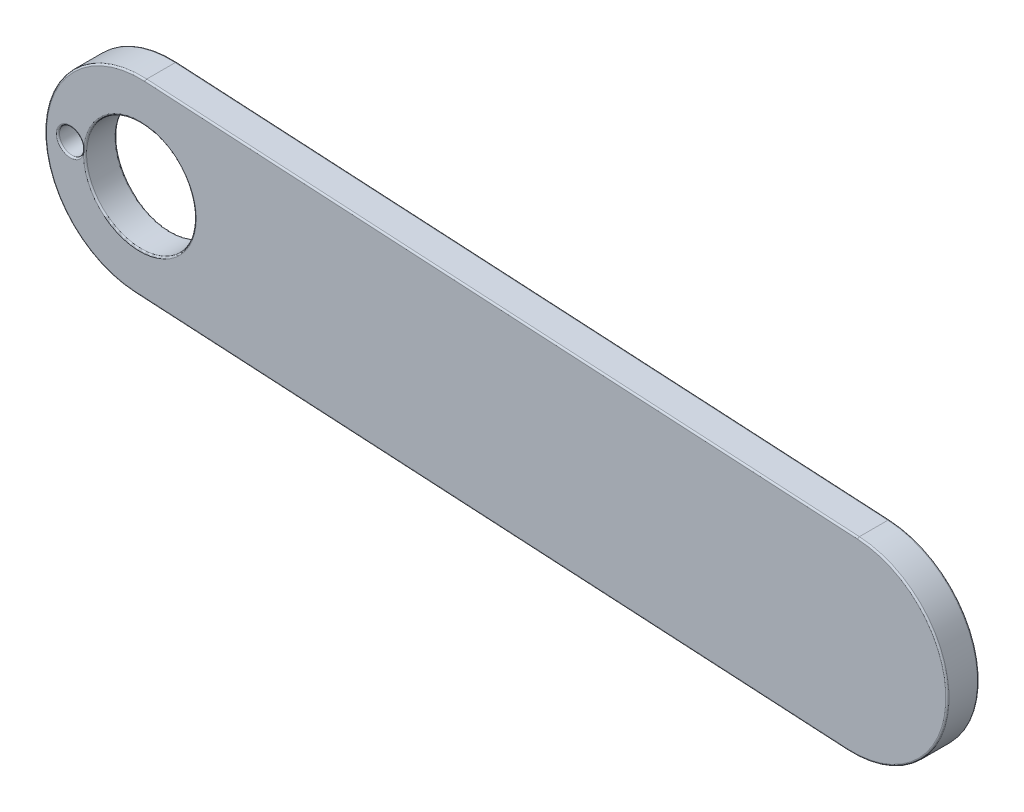
ISO-10303-21;
HEADER;
FILE_DESCRIPTION(('STEP AP214'),'2;1');
FILE_NAME('part.step','',(''),(''),'','','');
FILE_SCHEMA(('AUTOMOTIVE_DESIGN { 1 0 10303 214 1 1 1 1 }'));
ENDSEC;
DATA;
#1=APPLICATION_CONTEXT('core data for automotive mechanical design processes');
#2=APPLICATION_PROTOCOL_DEFINITION('international standard','automotive_design',2000,#1);
#3=PRODUCT_CONTEXT('',#1,'mechanical');
#4=PRODUCT('Part','Part','',(#3));
#5=PRODUCT_RELATED_PRODUCT_CATEGORY('part','',(#4));
#6=PRODUCT_DEFINITION_FORMATION('','',#4);
#7=PRODUCT_DEFINITION_CONTEXT('part definition',#1,'design');
#8=PRODUCT_DEFINITION('design','',#6,#7);
#9=PRODUCT_DEFINITION_SHAPE('','',#8);
#10=(LENGTH_UNIT() NAMED_UNIT(*) SI_UNIT(.MILLI.,.METRE.));
#11=(NAMED_UNIT(*) PLANE_ANGLE_UNIT() SI_UNIT($,.RADIAN.));
#12=(NAMED_UNIT(*) SI_UNIT($,.STERADIAN.) SOLID_ANGLE_UNIT());
#13=UNCERTAINTY_MEASURE_WITH_UNIT(LENGTH_MEASURE(1.E-05),#10,'distance_accuracy_value','');
#14=(GEOMETRIC_REPRESENTATION_CONTEXT(3) GLOBAL_UNCERTAINTY_ASSIGNED_CONTEXT((#13)) GLOBAL_UNIT_ASSIGNED_CONTEXT((#10,
#11,#12)) REPRESENTATION_CONTEXT('',''));
#15=CARTESIAN_POINT('',(0.,0.,0.));
#16=DIRECTION('',(0.,0.,1.));
#17=DIRECTION('',(1.,0.,0.));
#18=AXIS2_PLACEMENT_3D('',#15,#16,#17);
#19=CARTESIAN_POINT('',(0.,0.,6.35));
#20=DIRECTION('',(0.,0.,1.));
#21=DIRECTION('',(1.,0.,0.));
#22=AXIS2_PLACEMENT_3D('',#19,#20,#21);
#23=PLANE('',#22);
#24=CARTESIAN_POINT('',(143.002,-8.02483161981357,6.35));
#25=DIRECTION('',(0.,0.,1.));
#26=DIRECTION('',(1.,0.,0.));
#27=AXIS2_PLACEMENT_3D('',#24,#25,#26);
#28=CIRCLE('',#27,18.7325);
#29=CARTESIAN_POINT('',(141.95244110735,-26.7279057623406,6.35));
#30=VERTEX_POINT('',#29);
#31=CARTESIAN_POINT('',(144.051558892649,10.6782425227134,6.35));
#32=VERTEX_POINT('',#31);
#33=EDGE_CURVE('E43',#30,#32,#28,.T.);
#34=ORIENTED_EDGE('',*,*,#33,.T.);
#35=DIRECTION('',(-0.998429154812596,0.0560287677912468,0.));
#36=VECTOR('',#35,1.);
#37=CARTESIAN_POINT('',(1.04955889264953,18.703074142527,6.35));
#38=LINE('',#37,#36);
#39=CARTESIAN_POINT('',(1.04955889264953,18.703074142527,6.35));
#40=VERTEX_POINT('',#39);
#41=EDGE_CURVE('E11',#32,#40,#38,.T.);
#42=ORIENTED_EDGE('',*,*,#41,.T.);
#43=CARTESIAN_POINT('',(0.,0.,6.35));
#44=DIRECTION('',(0.,0.,1.));
#45=DIRECTION('',(1.,0.,0.));
#46=AXIS2_PLACEMENT_3D('',#43,#44,#45);
#47=CIRCLE('',#46,18.7325);
#48=CARTESIAN_POINT('',(-1.04955889264953,-18.703074142527,6.35));
#49=VERTEX_POINT('',#48);
#50=EDGE_CURVE('E190',#40,#49,#47,.T.);
#51=ORIENTED_EDGE('',*,*,#50,.T.);
#52=DIRECTION('',(0.998429154812596,-0.0560287677912467,0.));
#53=VECTOR('',#52,1.);
#54=CARTESIAN_POINT('',(141.95244110735,-26.7279057623406,6.35));
#55=LINE('',#54,#53);
#56=EDGE_CURVE('E54',#49,#30,#55,.T.);
#57=ORIENTED_EDGE('',*,*,#56,.T.);
#58=EDGE_LOOP('',(#34,#42,#51,#57));
#59=FACE_BOUND('',#58,.T.);
#60=CARTESIAN_POINT('',(0.,0.,6.35));
#61=DIRECTION('',(0.,0.,1.));
#62=DIRECTION('',(1.,0.,0.));
#63=AXIS2_PLACEMENT_3D('',#60,#61,#62);
#64=CIRCLE('',#63,11.3175);
#65=CARTESIAN_POINT('',(11.3175,0.,6.35));
#66=VERTEX_POINT('',#65);
#67=CARTESIAN_POINT('',(-11.3153450902125,-0.220843246224775,6.35));
#68=VERTEX_POINT('',#67);
#69=EDGE_CURVE('E183',#66,#68,#64,.F.);
#70=ORIENTED_EDGE('',*,*,#69,.T.);
#71=CARTESIAN_POINT('',(-13.948055292732,0.782721886043718,6.35));
#72=DIRECTION('',(0.,0.,1.));
#73=DIRECTION('',(1.,0.,0.));
#74=AXIS2_PLACEMENT_3D('',#71,#72,#73);
#75=CIRCLE('',#74,2.817499953);
#76=CARTESIAN_POINT('',(-11.2195940351805,1.48543459490541,6.35));
#77=VERTEX_POINT('',#76);
#78=EDGE_CURVE('E187',#68,#77,#75,.F.);
#79=ORIENTED_EDGE('',*,*,#78,.T.);
#80=CARTESIAN_POINT('',(0.,0.,6.35));
#81=DIRECTION('',(0.,0.,1.));
#82=DIRECTION('',(1.,0.,0.));
#83=AXIS2_PLACEMENT_3D('',#80,#81,#82);
#84=CIRCLE('',#83,11.3175);
#85=EDGE_CURVE('E185',#77,#66,#84,.F.);
#86=ORIENTED_EDGE('',*,*,#85,.T.);
#87=EDGE_LOOP('',(#70,#79,#86));
#88=FACE_BOUND('',#87,.T.);
#89=ADVANCED_FACE('F34',(#59,#88),#23,.T.);
#90=CARTESIAN_POINT('',(0.,0.,0.));
#91=DIRECTION('',(0.,0.,1.));
#92=DIRECTION('',(1.,0.,0.));
#93=AXIS2_PLACEMENT_3D('',#90,#91,#92);
#94=PLANE('',#93);
#95=CARTESIAN_POINT('',(0.,0.,0.));
#96=DIRECTION('',(0.,0.,1.));
#97=DIRECTION('',(1.,0.,0.));
#98=AXIS2_PLACEMENT_3D('',#95,#96,#97);
#99=CIRCLE('',#98,11.3175);
#100=CARTESIAN_POINT('',(11.3175,0.,0.));
#101=VERTEX_POINT('',#100);
#102=CARTESIAN_POINT('',(-11.2195940351805,1.48543459490541,0.));
#103=VERTEX_POINT('',#102);
#104=EDGE_CURVE('E144',#101,#103,#99,.T.);
#105=ORIENTED_EDGE('',*,*,#104,.T.);
#106=CARTESIAN_POINT('',(-13.948055292732,0.782721886043718,0.));
#107=DIRECTION('',(0.,0.,1.));
#108=DIRECTION('',(1.,0.,0.));
#109=AXIS2_PLACEMENT_3D('',#106,#107,#108);
#110=CIRCLE('',#109,2.817499953);
#111=CARTESIAN_POINT('',(-11.3153450902125,-0.220843246224775,0.));
#112=VERTEX_POINT('',#111);
#113=EDGE_CURVE('E152',#103,#112,#110,.T.);
#114=ORIENTED_EDGE('',*,*,#113,.T.);
#115=CARTESIAN_POINT('',(0.,0.,0.));
#116=DIRECTION('',(0.,0.,1.));
#117=DIRECTION('',(1.,0.,0.));
#118=AXIS2_PLACEMENT_3D('',#115,#116,#117);
#119=CIRCLE('',#118,11.3175);
#120=EDGE_CURVE('E146',#112,#101,#119,.T.);
#121=ORIENTED_EDGE('',*,*,#120,.T.);
#122=EDGE_LOOP('',(#105,#114,#121));
#123=FACE_BOUND('',#122,.T.);
#124=CARTESIAN_POINT('',(143.002,-8.02483161981357,0.));
#125=DIRECTION('',(0.,0.,1.));
#126=DIRECTION('',(1.,0.,0.));
#127=AXIS2_PLACEMENT_3D('',#124,#125,#126);
#128=CIRCLE('',#127,18.7325);
#129=CARTESIAN_POINT('',(144.051558892649,10.6782425227134,0.));
#130=VERTEX_POINT('',#129);
#131=CARTESIAN_POINT('',(141.95244110735,-26.7279057623406,0.));
#132=VERTEX_POINT('',#131);
#133=EDGE_CURVE('E143',#130,#132,#128,.F.);
#134=ORIENTED_EDGE('',*,*,#133,.T.);
#135=DIRECTION('',(0.998429154812596,-0.0560287677912467,0.));
#136=VECTOR('',#135,1.);
#137=CARTESIAN_POINT('',(-1.04955889264953,-18.703074142527,0.));
#138=LINE('',#137,#136);
#139=CARTESIAN_POINT('',(-1.04955889264953,-18.703074142527,0.));
#140=VERTEX_POINT('',#139);
#141=EDGE_CURVE('E122',#132,#140,#138,.F.);
#142=ORIENTED_EDGE('',*,*,#141,.T.);
#143=CARTESIAN_POINT('',(0.,0.,0.));
#144=DIRECTION('',(0.,0.,1.));
#145=DIRECTION('',(1.,0.,0.));
#146=AXIS2_PLACEMENT_3D('',#143,#144,#145);
#147=CIRCLE('',#146,18.7325);
#148=CARTESIAN_POINT('',(1.04955889264953,18.703074142527,0.));
#149=VERTEX_POINT('',#148);
#150=EDGE_CURVE('E132',#140,#149,#147,.F.);
#151=ORIENTED_EDGE('',*,*,#150,.T.);
#152=DIRECTION('',(-0.998429154812596,0.0560287677912468,0.));
#153=VECTOR('',#152,1.);
#154=CARTESIAN_POINT('',(1.04955889264953,18.703074142527,0.));
#155=LINE('',#154,#153);
#156=EDGE_CURVE('E138',#149,#130,#155,.F.);
#157=ORIENTED_EDGE('',*,*,#156,.T.);
#158=EDGE_LOOP('',(#134,#142,#151,#157));
#159=FACE_BOUND('',#158,.T.);
#160=ADVANCED_FACE('F141',(#123,#159),#94,.F.);
#161=CARTESIAN_POINT('',(0.,0.,6.35));
#162=DIRECTION('',(0.,0.,-1.));
#163=DIRECTION('',(-1.,0.,0.));
#164=AXIS2_PLACEMENT_3D('',#161,#162,#163);
#165=CYLINDRICAL_SURFACE('',#164,19.05);
#166=DIRECTION('',(0.,0.,-1.));
#167=VECTOR('',#166,1.);
#168=CARTESIAN_POINT('',(1.06734802642325,19.02007539918,6.35));
#169=LINE('',#168,#167);
#170=CARTESIAN_POINT('',(1.06734802642325,19.02007539918,6.0325));
#171=VERTEX_POINT('',#170);
#172=CARTESIAN_POINT('',(1.06734802642325,19.02007539918,0.3175));
#173=VERTEX_POINT('',#172);
#174=EDGE_CURVE('E202',#171,#173,#169,.T.);
#175=ORIENTED_EDGE('',*,*,#174,.T.);
#176=CARTESIAN_POINT('',(0.,0.,0.3175));
#177=DIRECTION('',(0.,0.,1.));
#178=DIRECTION('',(1.,0.,0.));
#179=AXIS2_PLACEMENT_3D('',#176,#177,#178);
#180=CIRCLE('',#179,19.05);
#181=CARTESIAN_POINT('',(-1.06734802642325,-19.02007539918,0.3175));
#182=VERTEX_POINT('',#181);
#183=EDGE_CURVE('E181',#173,#182,#180,.T.);
#184=ORIENTED_EDGE('',*,*,#183,.T.);
#185=DIRECTION('',(0.,0.,-1.));
#186=VECTOR('',#185,1.);
#187=CARTESIAN_POINT('',(-1.06734802642325,-19.02007539918,6.35));
#188=LINE('',#187,#186);
#189=CARTESIAN_POINT('',(-1.06734802642325,-19.02007539918,6.0325));
#190=VERTEX_POINT('',#189);
#191=EDGE_CURVE('E139',#190,#182,#188,.T.);
#192=ORIENTED_EDGE('',*,*,#191,.F.);
#193=CARTESIAN_POINT('',(0.,0.,6.0325));
#194=DIRECTION('',(0.,0.,1.));
#195=DIRECTION('',(1.,0.,0.));
#196=AXIS2_PLACEMENT_3D('',#193,#194,#195);
#197=CIRCLE('',#196,19.05);
#198=EDGE_CURVE('E179',#190,#171,#197,.F.);
#199=ORIENTED_EDGE('',*,*,#198,.T.);
#200=EDGE_LOOP('',(#175,#184,#192,#199));
#201=FACE_BOUND('',#200,.T.);
#202=ADVANCED_FACE('F268',(#201),#165,.T.);
#203=CARTESIAN_POINT('',(-1.06734802642325,-19.02007539918,6.35));
#204=DIRECTION('',(0.0560287677912466,0.998429154812596,0.));
#205=DIRECTION('',(-0.998429154812596,0.0560287677912467,0.));
#206=AXIS2_PLACEMENT_3D('',#203,#204,#205);
#207=PLANE('',#206);
#208=ORIENTED_EDGE('',*,*,#191,.T.);
#209=DIRECTION('',(0.998429154812596,-0.0560287677912467,0.));
#210=VECTOR('',#209,1.);
#211=CARTESIAN_POINT('',(-1.06734802642325,-19.02007539918,0.3175));
#212=LINE('',#211,#210);
#213=CARTESIAN_POINT('',(141.934651973577,-27.0449070189935,0.3175));
#214=VERTEX_POINT('',#213);
#215=EDGE_CURVE('E125',#182,#214,#212,.T.);
#216=ORIENTED_EDGE('',*,*,#215,.T.);
#217=DIRECTION('',(0.,0.,-1.));
#218=VECTOR('',#217,1.);
#219=CARTESIAN_POINT('',(141.934651973577,-27.0449070189935,6.35));
#220=LINE('',#219,#218);
#221=CARTESIAN_POINT('',(141.934651973577,-27.0449070189935,6.0325));
#222=VERTEX_POINT('',#221);
#223=EDGE_CURVE('E265',#222,#214,#220,.T.);
#224=ORIENTED_EDGE('',*,*,#223,.F.);
#225=DIRECTION('',(0.998429154812596,-0.0560287677912467,0.));
#226=VECTOR('',#225,1.);
#227=CARTESIAN_POINT('',(-1.06734802642325,-19.02007539918,6.0325));
#228=LINE('',#227,#226);
#229=EDGE_CURVE('E167',#222,#190,#228,.F.);
#230=ORIENTED_EDGE('',*,*,#229,.T.);
#231=EDGE_LOOP('',(#208,#216,#224,#230));
#232=FACE_BOUND('',#231,.T.);
#233=ADVANCED_FACE('F263',(#232),#207,.F.);
#234=CARTESIAN_POINT('',(143.002,-8.02483161981357,6.35));
#235=DIRECTION('',(0.,0.,-1.));
#236=DIRECTION('',(-1.,0.,0.));
#237=AXIS2_PLACEMENT_3D('',#234,#235,#236);
#238=CYLINDRICAL_SURFACE('',#237,19.05);
#239=ORIENTED_EDGE('',*,*,#223,.T.);
#240=CARTESIAN_POINT('',(143.002,-8.02483161981357,0.3175));
#241=DIRECTION('',(0.,0.,1.));
#242=DIRECTION('',(1.,0.,0.));
#243=AXIS2_PLACEMENT_3D('',#240,#241,#242);
#244=CIRCLE('',#243,19.05);
#245=CARTESIAN_POINT('',(144.069348026423,10.9952437793664,0.3175));
#246=VERTEX_POINT('',#245);
#247=EDGE_CURVE('E172',#214,#246,#244,.T.);
#248=ORIENTED_EDGE('',*,*,#247,.T.);
#249=DIRECTION('',(0.,0.,-1.));
#250=VECTOR('',#249,1.);
#251=CARTESIAN_POINT('',(144.069348026423,10.9952437793664,6.35));
#252=LINE('',#251,#250);
#253=CARTESIAN_POINT('',(144.069348026423,10.9952437793664,6.0325));
#254=VERTEX_POINT('',#253);
#255=EDGE_CURVE('E271',#254,#246,#252,.T.);
#256=ORIENTED_EDGE('',*,*,#255,.F.);
#257=CARTESIAN_POINT('',(143.002,-8.02483161981357,6.0325));
#258=DIRECTION('',(0.,0.,1.));
#259=DIRECTION('',(1.,0.,0.));
#260=AXIS2_PLACEMENT_3D('',#257,#258,#259);
#261=CIRCLE('',#260,19.05);
#262=EDGE_CURVE('E170',#254,#222,#261,.F.);
#263=ORIENTED_EDGE('',*,*,#262,.T.);
#264=EDGE_LOOP('',(#239,#248,#256,#263));
#265=FACE_BOUND('',#264,.T.);
#266=ADVANCED_FACE('F281',(#265),#238,.T.);
#267=CARTESIAN_POINT('',(1.06734802642325,19.02007539918,6.35));
#268=DIRECTION('',(-0.0560287677912468,-0.998429154812596,0.));
#269=DIRECTION('',(0.998429154812596,-0.0560287677912468,0.));
#270=AXIS2_PLACEMENT_3D('',#267,#268,#269);
#271=PLANE('',#270);
#272=ORIENTED_EDGE('',*,*,#255,.T.);
#273=DIRECTION('',(-0.998429154812596,0.0560287677912468,0.));
#274=VECTOR('',#273,1.);
#275=CARTESIAN_POINT('',(1.06734802642325,19.02007539918,0.3175));
#276=LINE('',#275,#274);
#277=EDGE_CURVE('E177',#246,#173,#276,.T.);
#278=ORIENTED_EDGE('',*,*,#277,.T.);
#279=ORIENTED_EDGE('',*,*,#174,.F.);
#280=DIRECTION('',(-0.998429154812596,0.0560287677912468,0.));
#281=VECTOR('',#280,1.);
#282=CARTESIAN_POINT('',(144.069348026423,10.9952437793664,6.0325));
#283=LINE('',#282,#281);
#284=EDGE_CURVE('E174',#171,#254,#283,.F.);
#285=ORIENTED_EDGE('',*,*,#284,.T.);
#286=EDGE_LOOP('',(#272,#278,#279,#285));
#287=FACE_BOUND('',#286,.T.);
#288=ADVANCED_FACE('F285',(#287),#271,.F.);
#289=CARTESIAN_POINT('',(0.,0.,6.35));
#290=DIRECTION('',(0.,0.,-1.));
#291=DIRECTION('',(-1.,0.,0.));
#292=AXIS2_PLACEMENT_3D('',#289,#290,#291);
#293=CYLINDRICAL_SURFACE('',#292,11.);
#294=CARTESIAN_POINT('',(0.,0.,0.3175));
#295=DIRECTION('',(0.,0.,1.));
#296=DIRECTION('',(1.,0.,0.));
#297=AXIS2_PLACEMENT_3D('',#294,#295,#296);
#298=CIRCLE('',#297,11.);
#299=CARTESIAN_POINT('',(11.,0.,0.3175));
#300=VERTEX_POINT('',#299);
#301=EDGE_CURVE('E164',#300,#300,#298,.F.);
#302=ORIENTED_EDGE('',*,*,#301,.T.);
#303=EDGE_LOOP('',(#302));
#304=FACE_BOUND('',#303,.T.);
#305=CARTESIAN_POINT('',(0.,0.,6.0325));
#306=DIRECTION('',(0.,0.,1.));
#307=DIRECTION('',(1.,0.,0.));
#308=AXIS2_PLACEMENT_3D('',#305,#306,#307);
#309=CIRCLE('',#308,11.);
#310=CARTESIAN_POINT('',(11.,0.,6.0325));
#311=VERTEX_POINT('',#310);
#312=EDGE_CURVE('E161',#311,#311,#309,.T.);
#313=ORIENTED_EDGE('',*,*,#312,.T.);
#314=EDGE_LOOP('',(#313));
#315=FACE_BOUND('',#314,.T.);
#316=ADVANCED_FACE('F305',(#304,#315),#293,.F.);
#317=CARTESIAN_POINT('',(-13.948055292732,0.782721886043718,6.35));
#318=DIRECTION('',(0.,0.,-1.));
#319=DIRECTION('',(-1.,0.,0.));
#320=AXIS2_PLACEMENT_3D('',#317,#318,#319);
#321=CYLINDRICAL_SURFACE('',#320,2.499999953);
#322=CARTESIAN_POINT('',(-13.948055292732,0.782721886043718,0.3175));
#323=DIRECTION('',(0.,0.,1.));
#324=DIRECTION('',(1.,0.,0.));
#325=AXIS2_PLACEMENT_3D('',#322,#323,#324);
#326=CIRCLE('',#325,2.499999953);
#327=CARTESIAN_POINT('',(-11.448055339732,0.782721886043718,0.3175));
#328=VERTEX_POINT('',#327);
#329=EDGE_CURVE('E158',#328,#328,#326,.F.);
#330=ORIENTED_EDGE('',*,*,#329,.T.);
#331=EDGE_LOOP('',(#330));
#332=FACE_BOUND('',#331,.T.);
#333=CARTESIAN_POINT('',(-13.948055292732,0.782721886043718,6.0325));
#334=DIRECTION('',(0.,0.,1.));
#335=DIRECTION('',(1.,0.,0.));
#336=AXIS2_PLACEMENT_3D('',#333,#334,#335);
#337=CIRCLE('',#336,2.499999953);
#338=CARTESIAN_POINT('',(-11.448055339732,0.782721886043718,6.0325));
#339=VERTEX_POINT('',#338);
#340=EDGE_CURVE('E155',#339,#339,#337,.T.);
#341=ORIENTED_EDGE('',*,*,#340,.T.);
#342=EDGE_LOOP('',(#341));
#343=FACE_BOUND('',#342,.T.);
#344=ADVANCED_FACE('F210',(#332,#343),#321,.F.);
#345=CARTESIAN_POINT('',(0.,0.,0.3175));
#346=DIRECTION('',(0.,0.,1.));
#347=DIRECTION('',(1.,0.,0.));
#348=AXIS2_PLACEMENT_3D('',#345,#346,#347);
#349=TOROIDAL_SURFACE('',#348,11.3175,0.3175);
#350=ORIENTED_EDGE('',*,*,#301,.F.);
#351=EDGE_LOOP('',(#350));
#352=FACE_BOUND('',#351,.T.);
#353=CARTESIAN_POINT('',(-11.2195940351805,1.48543459490541,0.));
#354=CARTESIAN_POINT('',(-11.2194771874451,1.48349661143987,1.89080414378658E-08));
#355=CARTESIAN_POINT('',(-11.2193610791172,1.48155858168488,6.6564911711708E-07));
#356=CARTESIAN_POINT('',(-11.2129501270631,1.37386094539171,7.0910528318239E-05));
#357=CARTESIAN_POINT('',(-11.2088577903836,1.26796548436848,0.00197825331571745));
#358=CARTESIAN_POINT('',(-11.2052347426499,1.05607829748729,0.00606418540357559));
#359=CARTESIAN_POINT('',(-11.2057055972445,0.950086551066242,0.00824286754851566));
#360=CARTESIAN_POINT('',(-11.2108425900697,0.755376631956622,0.0106320129922516));
#361=CARTESIAN_POINT('',(-11.2148160884263,0.666644329146415,0.0111043381516044));
#362=CARTESIAN_POINT('',(-11.2260321492161,0.489380105809248,0.010544957152584));
#363=CARTESIAN_POINT('',(-11.2332751526081,0.400848213930963,0.00951304807601143));
#364=CARTESIAN_POINT('',(-11.2509902109049,0.224152266046439,0.00657913022812782));
#365=CARTESIAN_POINT('',(-11.261461423973,0.135988120209114,0.00467734823554407));
#366=CARTESIAN_POINT('',(-11.2855631367317,-0.0399082548075556,0.00141781007819805));
#367=CARTESIAN_POINT('',(-11.2991929404085,-0.127640574799065,5.99342401492242E-05));
#368=CARTESIAN_POINT('',(-11.3146799428005,-0.217017632037599,6.61085038957426E-07));
#369=CARTESIAN_POINT('',(-11.315012151857,-0.218930503621343,1.42491666987701E-08));
#370=CARTESIAN_POINT('',(-11.3153450902125,-0.220843246224776,0.));
#371=B_SPLINE_CURVE_WITH_KNOTS('',3,(#353,#354,#355,#356,#357,#358,#359,#360,#361,#362,#363,
#364,#365,#366,#367,#368,#369,#370),.UNSPECIFIED.,.F.,.F.,(4,2,2,2,2,2,2,2,4),(0.,
0.00582451372086176,0.323664581224,0.641613704753086,0.908007770567193,1.17443777573536,
1.44079836128061,1.70710030843915,1.71292482216219),.UNSPECIFIED.);
#372=EDGE_CURVE('E194',#103,#112,#371,.T.);
#373=ORIENTED_EDGE('',*,*,#372,.F.);
#374=ORIENTED_EDGE('',*,*,#104,.F.);
#375=ORIENTED_EDGE('',*,*,#120,.F.);
#376=EDGE_LOOP('',(#373,#374,#375));
#377=FACE_BOUND('',#376,.T.);
#378=ADVANCED_FACE('F205',(#352,#377),#349,.T.);
#379=CARTESIAN_POINT('',(-13.948055292732,0.782721886043718,0.3175));
#380=DIRECTION('',(0.,0.,1.));
#381=DIRECTION('',(1.,0.,0.));
#382=AXIS2_PLACEMENT_3D('',#379,#380,#381);
#383=TOROIDAL_SURFACE('',#382,2.817499953,0.3175);
#384=ORIENTED_EDGE('',*,*,#329,.F.);
#385=EDGE_LOOP('',(#384));
#386=FACE_BOUND('',#385,.T.);
#387=ORIENTED_EDGE('',*,*,#113,.F.);
#388=ORIENTED_EDGE('',*,*,#372,.T.);
#389=EDGE_LOOP('',(#387,#388));
#390=FACE_BOUND('',#389,.T.);
#391=ADVANCED_FACE('F209',(#386,#390),#383,.T.);
#392=CARTESIAN_POINT('',(1.04955889264953,18.703074142527,0.3175));
#393=DIRECTION('',(-0.998429154812596,0.0560287677912468,0.));
#394=DIRECTION('',(-0.0560287677912468,-0.998429154812596,0.));
#395=AXIS2_PLACEMENT_3D('',#392,#393,#394);
#396=CYLINDRICAL_SURFACE('',#395,0.3175);
#397=CARTESIAN_POINT('',(144.051558892649,10.6782425227134,0.3175));
#398=DIRECTION('',(0.998429154812594,-0.0560287677912837,0.));
#399=DIRECTION('',(0.0560287677912837,0.998429154812594,0.));
#400=AXIS2_PLACEMENT_3D('',#397,#398,#399);
#401=CIRCLE('',#400,0.3175);
#402=EDGE_CURVE('E128',#130,#246,#401,.T.);
#403=ORIENTED_EDGE('',*,*,#402,.F.);
#404=ORIENTED_EDGE('',*,*,#156,.F.);
#405=CARTESIAN_POINT('',(1.04955889264953,18.703074142527,0.3175));
#406=DIRECTION('',(-0.998429154812596,0.056028767791247,0.));
#407=DIRECTION('',(-0.056028767791247,-0.998429154812596,0.));
#408=AXIS2_PLACEMENT_3D('',#405,#406,#407);
#409=CIRCLE('',#408,0.3175);
#410=EDGE_CURVE('E135',#173,#149,#409,.T.);
#411=ORIENTED_EDGE('',*,*,#410,.F.);
#412=ORIENTED_EDGE('',*,*,#277,.F.);
#413=EDGE_LOOP('',(#403,#404,#411,#412));
#414=FACE_BOUND('',#413,.T.);
#415=ADVANCED_FACE('F214',(#414),#396,.T.);
#416=CARTESIAN_POINT('',(0.,0.,0.3175));
#417=DIRECTION('',(0.,0.,1.));
#418=DIRECTION('',(1.,0.,0.));
#419=AXIS2_PLACEMENT_3D('',#416,#417,#418);
#420=TOROIDAL_SURFACE('',#419,18.7325,0.3175);
#421=ORIENTED_EDGE('',*,*,#410,.T.);
#422=ORIENTED_EDGE('',*,*,#150,.F.);
#423=CARTESIAN_POINT('',(-1.04955889264953,-18.703074142527,0.3175));
#424=DIRECTION('',(0.998429154812596,-0.056028767791247,0.));
#425=DIRECTION('',(0.056028767791247,0.998429154812596,0.));
#426=AXIS2_PLACEMENT_3D('',#423,#424,#425);
#427=CIRCLE('',#426,0.3175);
#428=EDGE_CURVE('E118',#182,#140,#427,.T.);
#429=ORIENTED_EDGE('',*,*,#428,.F.);
#430=ORIENTED_EDGE('',*,*,#183,.F.);
#431=EDGE_LOOP('',(#421,#422,#429,#430));
#432=FACE_BOUND('',#431,.T.);
#433=ADVANCED_FACE('F133',(#432),#420,.T.);
#434=CARTESIAN_POINT('',(143.002,-8.02483161981357,0.3175));
#435=DIRECTION('',(0.,0.,1.));
#436=DIRECTION('',(1.,0.,0.));
#437=AXIS2_PLACEMENT_3D('',#434,#435,#436);
#438=TOROIDAL_SURFACE('',#437,18.7325,0.3175);
#439=ORIENTED_EDGE('',*,*,#402,.T.);
#440=ORIENTED_EDGE('',*,*,#247,.F.);
#441=CARTESIAN_POINT('',(141.95244110735,-26.7279057623406,0.3175));
#442=DIRECTION('',(-0.998429154812594,0.0560287677912831,0.));
#443=DIRECTION('',(-0.0560287677912831,-0.998429154812594,0.));
#444=AXIS2_PLACEMENT_3D('',#441,#442,#443);
#445=CIRCLE('',#444,0.3175);
#446=EDGE_CURVE('E129',#132,#214,#445,.T.);
#447=ORIENTED_EDGE('',*,*,#446,.F.);
#448=ORIENTED_EDGE('',*,*,#133,.F.);
#449=EDGE_LOOP('',(#439,#440,#447,#448));
#450=FACE_BOUND('',#449,.T.);
#451=ADVANCED_FACE('F219',(#450),#438,.T.);
#452=CARTESIAN_POINT('',(-1.04955889264953,-18.703074142527,0.3175));
#453=DIRECTION('',(0.998429154812596,-0.0560287677912467,0.));
#454=DIRECTION('',(0.0560287677912467,0.998429154812596,0.));
#455=AXIS2_PLACEMENT_3D('',#452,#453,#454);
#456=CYLINDRICAL_SURFACE('',#455,0.3175);
#457=ORIENTED_EDGE('',*,*,#428,.T.);
#458=ORIENTED_EDGE('',*,*,#141,.F.);
#459=ORIENTED_EDGE('',*,*,#446,.T.);
#460=ORIENTED_EDGE('',*,*,#215,.F.);
#461=EDGE_LOOP('',(#457,#458,#459,#460));
#462=FACE_BOUND('',#461,.T.);
#463=ADVANCED_FACE('F120',(#462),#456,.T.);
#464=CARTESIAN_POINT('',(0.,0.,6.0325));
#465=DIRECTION('',(0.,0.,1.));
#466=DIRECTION('',(1.,0.,0.));
#467=AXIS2_PLACEMENT_3D('',#464,#465,#466);
#468=TOROIDAL_SURFACE('',#467,11.3175,0.3175);
#469=ORIENTED_EDGE('',*,*,#312,.F.);
#470=EDGE_LOOP('',(#469));
#471=FACE_BOUND('',#470,.T.);
#472=CARTESIAN_POINT('',(-11.2195940351805,1.48543459490541,6.35));
#473=CARTESIAN_POINT('',(-11.2194771874451,1.48349661143987,6.34999998109196));
#474=CARTESIAN_POINT('',(-11.2193610791172,1.48155858168488,6.34999933435088));
#475=CARTESIAN_POINT('',(-11.2129501270631,1.3738609453917,6.34992908947168));
#476=CARTESIAN_POINT('',(-11.2088577903836,1.26796548436848,6.34802174668428));
#477=CARTESIAN_POINT('',(-11.2052347426499,1.05607829748729,6.34393581459643));
#478=CARTESIAN_POINT('',(-11.2057055972445,0.950086551066241,6.34175713245148));
#479=CARTESIAN_POINT('',(-11.2108425900697,0.755376631956624,6.33936798700775));
#480=CARTESIAN_POINT('',(-11.2148160884263,0.666644329146418,6.3388956618484));
#481=CARTESIAN_POINT('',(-11.2260321492161,0.489380105809259,6.33945504284742));
#482=CARTESIAN_POINT('',(-11.2332751526081,0.40084821393098,6.34048695192399));
#483=CARTESIAN_POINT('',(-11.2509902109048,0.224152266046455,6.34342086977187));
#484=CARTESIAN_POINT('',(-11.2614614239729,0.135988120209124,6.34532265176446));
#485=CARTESIAN_POINT('',(-11.2855631367318,-0.0399082548075389,6.3485821899218));
#486=CARTESIAN_POINT('',(-11.2991929404087,-0.127640574799034,6.34994006575984));
#487=CARTESIAN_POINT('',(-11.3146799428005,-0.217017632037599,6.34999933891496));
#488=CARTESIAN_POINT('',(-11.315012151857,-0.218930503621343,6.34999998575083));
#489=CARTESIAN_POINT('',(-11.3153450902125,-0.220843246224776,6.35000000000001));
#490=B_SPLINE_CURVE_WITH_KNOTS('',3,(#472,#473,#474,#475,#476,#477,#478,#479,#480,#481,#482,
#483,#484,#485,#486,#487,#488,#489),.UNSPECIFIED.,.F.,.F.,(4,2,2,2,2,2,2,2,4),(0.,
0.00582451372086176,0.323664581224005,0.641613704753086,0.908007770567188,1.17443777573534,
1.44079836128059,1.70710030843915,1.71292482216219),.UNSPECIFIED.);
#491=EDGE_CURVE('E236',#68,#77,#490,.F.);
#492=ORIENTED_EDGE('',*,*,#491,.F.);
#493=ORIENTED_EDGE('',*,*,#69,.F.);
#494=ORIENTED_EDGE('',*,*,#85,.F.);
#495=EDGE_LOOP('',(#492,#493,#494));
#496=FACE_BOUND('',#495,.T.);
#497=ADVANCED_FACE('F218',(#471,#496),#468,.T.);
#498=CARTESIAN_POINT('',(-13.948055292732,0.782721886043718,6.0325));
#499=DIRECTION('',(0.,0.,1.));
#500=DIRECTION('',(1.,0.,0.));
#501=AXIS2_PLACEMENT_3D('',#498,#499,#500);
#502=TOROIDAL_SURFACE('',#501,2.817499953,0.3175);
#503=ORIENTED_EDGE('',*,*,#78,.F.);
#504=ORIENTED_EDGE('',*,*,#491,.T.);
#505=EDGE_LOOP('',(#503,#504));
#506=FACE_BOUND('',#505,.T.);
#507=ORIENTED_EDGE('',*,*,#340,.F.);
#508=EDGE_LOOP('',(#507));
#509=FACE_BOUND('',#508,.T.);
#510=ADVANCED_FACE('F231',(#506,#509),#502,.T.);
#511=CARTESIAN_POINT('',(-1.04955889264953,-18.703074142527,6.0325));
#512=DIRECTION('',(-0.998429154812596,0.0560287677912467,0.));
#513=DIRECTION('',(-0.0560287677912467,-0.998429154812596,0.));
#514=AXIS2_PLACEMENT_3D('',#511,#512,#513);
#515=CYLINDRICAL_SURFACE('',#514,0.3175);
#516=CARTESIAN_POINT('',(-1.04955889264953,-18.703074142527,6.0325));
#517=DIRECTION('',(-0.998429154812596,0.056028767791247,0.));
#518=DIRECTION('',(-0.056028767791247,-0.998429154812596,0.));
#519=AXIS2_PLACEMENT_3D('',#516,#517,#518);
#520=CIRCLE('',#519,0.3175);
#521=EDGE_CURVE('E247',#190,#49,#520,.T.);
#522=ORIENTED_EDGE('',*,*,#521,.F.);
#523=ORIENTED_EDGE('',*,*,#229,.F.);
#524=CARTESIAN_POINT('',(141.95244110735,-26.7279057623406,6.0325));
#525=DIRECTION('',(0.998429154812594,-0.0560287677912837,0.));
#526=DIRECTION('',(0.0560287677912837,0.998429154812594,0.));
#527=AXIS2_PLACEMENT_3D('',#524,#525,#526);
#528=CIRCLE('',#527,0.3175);
#529=EDGE_CURVE('E38',#30,#222,#528,.T.);
#530=ORIENTED_EDGE('',*,*,#529,.F.);
#531=ORIENTED_EDGE('',*,*,#56,.F.);
#532=EDGE_LOOP('',(#522,#523,#530,#531));
#533=FACE_BOUND('',#532,.T.);
#534=ADVANCED_FACE('F36',(#533),#515,.T.);
#535=CARTESIAN_POINT('',(143.002,-8.02483161981357,6.0325));
#536=DIRECTION('',(0.,0.,1.));
#537=DIRECTION('',(1.,0.,0.));
#538=AXIS2_PLACEMENT_3D('',#535,#536,#537);
#539=TOROIDAL_SURFACE('',#538,18.7325,0.3175);
#540=ORIENTED_EDGE('',*,*,#529,.T.);
#541=ORIENTED_EDGE('',*,*,#262,.F.);
#542=CARTESIAN_POINT('',(144.051558892649,10.6782425227134,6.0325));
#543=DIRECTION('',(-0.998429154812594,0.0560287677912846,0.));
#544=DIRECTION('',(-0.0560287677912846,-0.998429154812594,0.));
#545=AXIS2_PLACEMENT_3D('',#542,#543,#544);
#546=CIRCLE('',#545,0.3175);
#547=EDGE_CURVE('E246',#32,#254,#546,.T.);
#548=ORIENTED_EDGE('',*,*,#547,.F.);
#549=ORIENTED_EDGE('',*,*,#33,.F.);
#550=EDGE_LOOP('',(#540,#541,#548,#549));
#551=FACE_BOUND('',#550,.T.);
#552=ADVANCED_FACE('F256',(#551),#539,.T.);
#553=CARTESIAN_POINT('',(0.,0.,6.0325));
#554=DIRECTION('',(0.,0.,1.));
#555=DIRECTION('',(1.,0.,0.));
#556=AXIS2_PLACEMENT_3D('',#553,#554,#555);
#557=TOROIDAL_SURFACE('',#556,18.7325,0.3175);
#558=ORIENTED_EDGE('',*,*,#521,.T.);
#559=ORIENTED_EDGE('',*,*,#50,.F.);
#560=CARTESIAN_POINT('',(1.04955889264953,18.703074142527,6.0325));
#561=DIRECTION('',(0.998429154812596,-0.056028767791247,0.));
#562=DIRECTION('',(0.056028767791247,0.998429154812596,0.));
#563=AXIS2_PLACEMENT_3D('',#560,#561,#562);
#564=CIRCLE('',#563,0.3175);
#565=EDGE_CURVE('E244',#171,#40,#564,.T.);
#566=ORIENTED_EDGE('',*,*,#565,.F.);
#567=ORIENTED_EDGE('',*,*,#198,.F.);
#568=EDGE_LOOP('',(#558,#559,#566,#567));
#569=FACE_BOUND('',#568,.T.);
#570=ADVANCED_FACE('F290',(#569),#557,.T.);
#571=CARTESIAN_POINT('',(1.04955889264953,18.703074142527,6.0325));
#572=DIRECTION('',(0.998429154812596,-0.0560287677912468,0.));
#573=DIRECTION('',(0.0560287677912468,0.998429154812596,0.));
#574=AXIS2_PLACEMENT_3D('',#571,#572,#573);
#575=CYLINDRICAL_SURFACE('',#574,0.3175);
#576=ORIENTED_EDGE('',*,*,#547,.T.);
#577=ORIENTED_EDGE('',*,*,#284,.F.);
#578=ORIENTED_EDGE('',*,*,#565,.T.);
#579=ORIENTED_EDGE('',*,*,#41,.F.);
#580=EDGE_LOOP('',(#576,#577,#578,#579));
#581=FACE_BOUND('',#580,.T.);
#582=ADVANCED_FACE('F288',(#581),#575,.T.);
#583=CLOSED_SHELL('',(#89,#160,#202,#233,#266,#288,#316,#344,#378,#391,#415,#433,#451,#463,#497,
#510,#534,#552,#570,#582));
#584=MANIFOLD_SOLID_BREP('B2',#583);
#585=ADVANCED_BREP_SHAPE_REPRESENTATION('',(#18,#584),#14);
#586=SHAPE_DEFINITION_REPRESENTATION(#9,#585);
ENDSEC;
END-ISO-10303-21;
